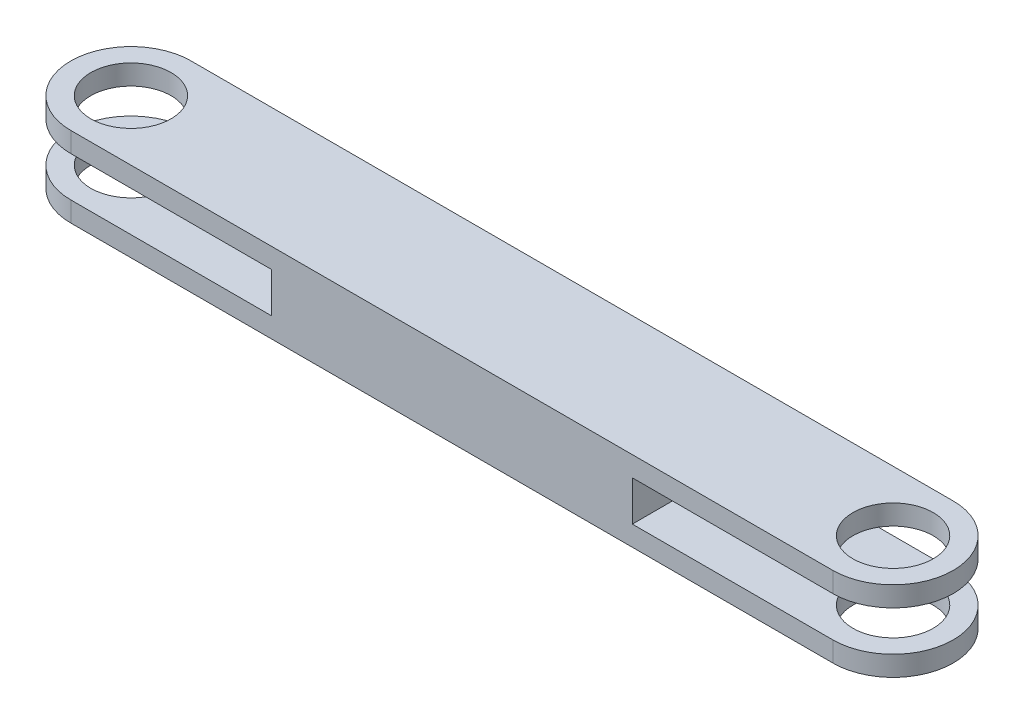
ISO-10303-21;
HEADER;
FILE_DESCRIPTION(('STEP AP214'),'2;1');
FILE_NAME('part.step','',(''),(''),'','','');
FILE_SCHEMA(('AUTOMOTIVE_DESIGN { 1 0 10303 214 1 1 1 1 }'));
ENDSEC;
DATA;
#1=APPLICATION_CONTEXT('core data for automotive mechanical design processes');
#2=APPLICATION_PROTOCOL_DEFINITION('international standard','automotive_design',2000,#1);
#3=PRODUCT_CONTEXT('',#1,'mechanical');
#4=PRODUCT('Part','Part','',(#3));
#5=PRODUCT_RELATED_PRODUCT_CATEGORY('part','',(#4));
#6=PRODUCT_DEFINITION_FORMATION('','',#4);
#7=PRODUCT_DEFINITION_CONTEXT('part definition',#1,'design');
#8=PRODUCT_DEFINITION('design','',#6,#7);
#9=PRODUCT_DEFINITION_SHAPE('','',#8);
#10=(LENGTH_UNIT() NAMED_UNIT(*) SI_UNIT(.MILLI.,.METRE.));
#11=(NAMED_UNIT(*) PLANE_ANGLE_UNIT() SI_UNIT($,.RADIAN.));
#12=(NAMED_UNIT(*) SI_UNIT($,.STERADIAN.) SOLID_ANGLE_UNIT());
#13=UNCERTAINTY_MEASURE_WITH_UNIT(LENGTH_MEASURE(1.E-05),#10,'distance_accuracy_value','');
#14=(GEOMETRIC_REPRESENTATION_CONTEXT(3) GLOBAL_UNCERTAINTY_ASSIGNED_CONTEXT((#13)) GLOBAL_UNIT_ASSIGNED_CONTEXT((#10,
#11,#12)) REPRESENTATION_CONTEXT('',''));
#15=CARTESIAN_POINT('',(0.,0.,0.));
#16=DIRECTION('',(0.,0.,1.));
#17=DIRECTION('',(1.,0.,0.));
#18=AXIS2_PLACEMENT_3D('',#15,#16,#17);
#19=CARTESIAN_POINT('',(0.,10.,15.));
#20=DIRECTION('',(0.,0.,-1.));
#21=DIRECTION('',(-1.,0.,0.));
#22=AXIS2_PLACEMENT_3D('',#19,#20,#21);
#23=PLANE('',#22);
#24=DIRECTION('',(-1.,0.,0.));
#25=VECTOR('',#24,1.);
#26=CARTESIAN_POINT('',(94.9999999999999,-5.,15.));
#27=LINE('',#26,#25);
#28=CARTESIAN_POINT('',(94.9999999999999,-5.,15.));
#29=VERTEX_POINT('',#28);
#30=CARTESIAN_POINT('',(45.,-5.,15.));
#31=VERTEX_POINT('',#30);
#32=EDGE_CURVE('E136',#29,#31,#27,.T.);
#33=ORIENTED_EDGE('',*,*,#32,.T.);
#34=DIRECTION('',(0.,1.,0.));
#35=VECTOR('',#34,1.);
#36=CARTESIAN_POINT('',(45.,-5.,15.));
#37=LINE('',#36,#35);
#38=CARTESIAN_POINT('',(45.,5.,15.));
#39=VERTEX_POINT('',#38);
#40=EDGE_CURVE('E133',#31,#39,#37,.T.);
#41=ORIENTED_EDGE('',*,*,#40,.T.);
#42=DIRECTION('',(-1.,0.,0.));
#43=VECTOR('',#42,1.);
#44=CARTESIAN_POINT('',(94.9999999999999,5.,15.));
#45=LINE('',#44,#43);
#46=CARTESIAN_POINT('',(94.9999999999999,5.,15.));
#47=VERTEX_POINT('',#46);
#48=EDGE_CURVE('E305',#47,#39,#45,.T.);
#49=ORIENTED_EDGE('',*,*,#48,.F.);
#50=DIRECTION('',(0.,-1.,0.));
#51=VECTOR('',#50,1.);
#52=CARTESIAN_POINT('',(95.,10.,15.));
#53=LINE('',#52,#51);
#54=CARTESIAN_POINT('',(95.,10.,15.));
#55=VERTEX_POINT('',#54);
#56=EDGE_CURVE('E222',#55,#47,#53,.T.);
#57=ORIENTED_EDGE('',*,*,#56,.F.);
#58=DIRECTION('',(1.,0.,0.));
#59=VECTOR('',#58,1.);
#60=CARTESIAN_POINT('',(0.,10.,15.));
#61=LINE('',#60,#59);
#62=CARTESIAN_POINT('',(-94.9999999999999,10.,15.));
#63=VERTEX_POINT('',#62);
#64=EDGE_CURVE('E186',#63,#55,#61,.T.);
#65=ORIENTED_EDGE('',*,*,#64,.F.);
#66=DIRECTION('',(0.,-1.,0.));
#67=VECTOR('',#66,1.);
#68=CARTESIAN_POINT('',(-94.9999999999999,10.,15.));
#69=LINE('',#68,#67);
#70=CARTESIAN_POINT('',(-94.9999999999999,5.,15.));
#71=VERTEX_POINT('',#70);
#72=EDGE_CURVE('E11',#63,#71,#69,.T.);
#73=ORIENTED_EDGE('',*,*,#72,.T.);
#74=DIRECTION('',(1.,0.,0.));
#75=VECTOR('',#74,1.);
#76=CARTESIAN_POINT('',(-94.9999999999999,5.,15.));
#77=LINE('',#76,#75);
#78=CARTESIAN_POINT('',(-45.,5.,15.));
#79=VERTEX_POINT('',#78);
#80=EDGE_CURVE('E169',#71,#79,#77,.T.);
#81=ORIENTED_EDGE('',*,*,#80,.T.);
#82=DIRECTION('',(0.,1.,0.));
#83=VECTOR('',#82,1.);
#84=CARTESIAN_POINT('',(-45.,-5.,15.));
#85=LINE('',#84,#83);
#86=CARTESIAN_POINT('',(-45.,-5.,15.));
#87=VERTEX_POINT('',#86);
#88=EDGE_CURVE('E165',#87,#79,#85,.T.);
#89=ORIENTED_EDGE('',*,*,#88,.F.);
#90=DIRECTION('',(1.,0.,0.));
#91=VECTOR('',#90,1.);
#92=CARTESIAN_POINT('',(-94.9999999999999,-5.,15.));
#93=LINE('',#92,#91);
#94=CARTESIAN_POINT('',(-94.9999999999999,-5.,15.));
#95=VERTEX_POINT('',#94);
#96=EDGE_CURVE('E160',#95,#87,#93,.T.);
#97=ORIENTED_EDGE('',*,*,#96,.F.);
#98=CARTESIAN_POINT('',(-94.9999999999999,-10.,15.));
#99=VERTEX_POINT('',#98);
#100=EDGE_CURVE('E44',#95,#99,#69,.T.);
#101=ORIENTED_EDGE('',*,*,#100,.T.);
#102=DIRECTION('',(1.,0.,0.));
#103=VECTOR('',#102,1.);
#104=CARTESIAN_POINT('',(0.,-10.,15.));
#105=LINE('',#104,#103);
#106=CARTESIAN_POINT('',(95.,-10.,15.));
#107=VERTEX_POINT('',#106);
#108=EDGE_CURVE('E204',#99,#107,#105,.T.);
#109=ORIENTED_EDGE('',*,*,#108,.T.);
#110=EDGE_CURVE('E221',#29,#107,#53,.T.);
#111=ORIENTED_EDGE('',*,*,#110,.F.);
#112=EDGE_LOOP('',(#33,#41,#49,#57,#65,#73,#81,#89,#97,#101,#109,#111));
#113=FACE_BOUND('',#112,.T.);
#114=ADVANCED_FACE('F35',(#113),#23,.F.);
#115=CARTESIAN_POINT('',(0.,10.,-15.));
#116=DIRECTION('',(0.,0.,-1.));
#117=DIRECTION('',(-1.,0.,0.));
#118=AXIS2_PLACEMENT_3D('',#115,#116,#117);
#119=PLANE('',#118);
#120=DIRECTION('',(0.,1.,0.));
#121=VECTOR('',#120,1.);
#122=CARTESIAN_POINT('',(44.9999999999999,-5.,-15.));
#123=LINE('',#122,#121);
#124=CARTESIAN_POINT('',(44.9999999999999,-5.,-15.));
#125=VERTEX_POINT('',#124);
#126=CARTESIAN_POINT('',(44.9999999999999,5.,-15.));
#127=VERTEX_POINT('',#126);
#128=EDGE_CURVE('E131',#125,#127,#123,.T.);
#129=ORIENTED_EDGE('',*,*,#128,.F.);
#130=DIRECTION('',(1.,0.,0.));
#131=VECTOR('',#130,1.);
#132=CARTESIAN_POINT('',(44.9999999999999,-5.,-15.));
#133=LINE('',#132,#131);
#134=CARTESIAN_POINT('',(95.,-5.,-15.));
#135=VERTEX_POINT('',#134);
#136=EDGE_CURVE('E137',#125,#135,#133,.T.);
#137=ORIENTED_EDGE('',*,*,#136,.T.);
#138=DIRECTION('',(0.,-1.,0.));
#139=VECTOR('',#138,1.);
#140=CARTESIAN_POINT('',(95.,10.,-15.));
#141=LINE('',#140,#139);
#142=CARTESIAN_POINT('',(95.,-10.,-15.));
#143=VERTEX_POINT('',#142);
#144=EDGE_CURVE('E218',#135,#143,#141,.T.);
#145=ORIENTED_EDGE('',*,*,#144,.T.);
#146=DIRECTION('',(1.,0.,0.));
#147=VECTOR('',#146,1.);
#148=CARTESIAN_POINT('',(0.,-10.,-15.));
#149=LINE('',#148,#147);
#150=CARTESIAN_POINT('',(-95.,-10.,-15.));
#151=VERTEX_POINT('',#150);
#152=EDGE_CURVE('E210',#151,#143,#149,.T.);
#153=ORIENTED_EDGE('',*,*,#152,.F.);
#154=DIRECTION('',(0.,-1.,0.));
#155=VECTOR('',#154,1.);
#156=CARTESIAN_POINT('',(-95.,10.,-15.));
#157=LINE('',#156,#155);
#158=CARTESIAN_POINT('',(-95.,-5.,-15.));
#159=VERTEX_POINT('',#158);
#160=EDGE_CURVE('E196',#159,#151,#157,.T.);
#161=ORIENTED_EDGE('',*,*,#160,.F.);
#162=DIRECTION('',(-1.,0.,0.));
#163=VECTOR('',#162,1.);
#164=CARTESIAN_POINT('',(-44.9999999999999,-5.,-15.));
#165=LINE('',#164,#163);
#166=CARTESIAN_POINT('',(-44.9999999999999,-5.,-15.));
#167=VERTEX_POINT('',#166);
#168=EDGE_CURVE('E155',#167,#159,#165,.T.);
#169=ORIENTED_EDGE('',*,*,#168,.F.);
#170=DIRECTION('',(0.,1.,0.));
#171=VECTOR('',#170,1.);
#172=CARTESIAN_POINT('',(-44.9999999999999,-5.,-15.));
#173=LINE('',#172,#171);
#174=CARTESIAN_POINT('',(-44.9999999999999,5.,-15.));
#175=VERTEX_POINT('',#174);
#176=EDGE_CURVE('E174',#167,#175,#173,.T.);
#177=ORIENTED_EDGE('',*,*,#176,.T.);
#178=DIRECTION('',(-1.,0.,0.));
#179=VECTOR('',#178,1.);
#180=CARTESIAN_POINT('',(-44.9999999999999,5.,-15.));
#181=LINE('',#180,#179);
#182=CARTESIAN_POINT('',(-95.,5.,-15.));
#183=VERTEX_POINT('',#182);
#184=EDGE_CURVE('E166',#175,#183,#181,.T.);
#185=ORIENTED_EDGE('',*,*,#184,.T.);
#186=CARTESIAN_POINT('',(-95.,10.,-15.));
#187=VERTEX_POINT('',#186);
#188=EDGE_CURVE('E215',#187,#183,#157,.T.);
#189=ORIENTED_EDGE('',*,*,#188,.F.);
#190=DIRECTION('',(1.,0.,0.));
#191=VECTOR('',#190,1.);
#192=CARTESIAN_POINT('',(0.,10.,-15.));
#193=LINE('',#192,#191);
#194=CARTESIAN_POINT('',(95.,10.,-15.));
#195=VERTEX_POINT('',#194);
#196=EDGE_CURVE('E190',#187,#195,#193,.T.);
#197=ORIENTED_EDGE('',*,*,#196,.T.);
#198=CARTESIAN_POINT('',(95.,5.,-15.));
#199=VERTEX_POINT('',#198);
#200=EDGE_CURVE('E219',#195,#199,#141,.T.);
#201=ORIENTED_EDGE('',*,*,#200,.T.);
#202=DIRECTION('',(1.,0.,0.));
#203=VECTOR('',#202,1.);
#204=CARTESIAN_POINT('',(44.9999999999999,5.,-15.));
#205=LINE('',#204,#203);
#206=EDGE_CURVE('E52',#127,#199,#205,.T.);
#207=ORIENTED_EDGE('',*,*,#206,.F.);
#208=EDGE_LOOP('',(#129,#137,#145,#153,#161,#169,#177,#185,#189,#197,#201,#207));
#209=FACE_BOUND('',#208,.T.);
#210=ADVANCED_FACE('F147',(#209),#119,.T.);
#211=CARTESIAN_POINT('',(95.,10.,0.));
#212=DIRECTION('',(0.,-1.,0.));
#213=DIRECTION('',(0.,0.,-1.));
#214=AXIS2_PLACEMENT_3D('',#211,#212,#213);
#215=CYLINDRICAL_SURFACE('',#214,15.);
#216=CARTESIAN_POINT('',(95.,-5.,0.));
#217=DIRECTION('',(0.,-1.,0.));
#218=DIRECTION('',(0.,0.,1.));
#219=AXIS2_PLACEMENT_3D('',#216,#217,#218);
#220=CIRCLE('',#219,15.);
#221=EDGE_CURVE('E142',#135,#29,#220,.T.);
#222=ORIENTED_EDGE('',*,*,#221,.T.);
#223=ORIENTED_EDGE('',*,*,#110,.T.);
#224=CARTESIAN_POINT('',(95.,-10.,0.));
#225=DIRECTION('',(0.,1.,0.));
#226=DIRECTION('',(0.,0.,1.));
#227=AXIS2_PLACEMENT_3D('',#224,#225,#226);
#228=CIRCLE('',#227,15.);
#229=EDGE_CURVE('E207',#107,#143,#228,.T.);
#230=ORIENTED_EDGE('',*,*,#229,.T.);
#231=ORIENTED_EDGE('',*,*,#144,.F.);
#232=EDGE_LOOP('',(#222,#223,#230,#231));
#233=FACE_BOUND('',#232,.T.);
#234=ADVANCED_FACE('F252',(#233),#215,.T.);
#235=CARTESIAN_POINT('',(95.,10.,0.));
#236=DIRECTION('',(0.,-1.,0.));
#237=DIRECTION('',(0.,0.,-1.));
#238=AXIS2_PLACEMENT_3D('',#235,#236,#237);
#239=CYLINDRICAL_SURFACE('',#238,10.);
#240=CARTESIAN_POINT('',(95.,-10.,0.));
#241=DIRECTION('',(0.,1.,0.));
#242=DIRECTION('',(0.,0.,1.));
#243=AXIS2_PLACEMENT_3D('',#240,#241,#242);
#244=CIRCLE('',#243,10.);
#245=CARTESIAN_POINT('',(95.,-10.,10.));
#246=VERTEX_POINT('',#245);
#247=EDGE_CURVE('E197',#246,#246,#244,.T.);
#248=ORIENTED_EDGE('',*,*,#247,.F.);
#249=EDGE_LOOP('',(#248));
#250=FACE_BOUND('',#249,.T.);
#251=CARTESIAN_POINT('',(95.,-5.,0.));
#252=DIRECTION('',(0.,1.,0.));
#253=DIRECTION('',(0.,0.,1.));
#254=AXIS2_PLACEMENT_3D('',#251,#252,#253);
#255=CIRCLE('',#254,10.);
#256=CARTESIAN_POINT('',(95.,-5.,10.));
#257=VERTEX_POINT('',#256);
#258=EDGE_CURVE('E39',#257,#257,#255,.T.);
#259=ORIENTED_EDGE('',*,*,#258,.T.);
#260=EDGE_LOOP('',(#259));
#261=FACE_BOUND('',#260,.T.);
#262=ADVANCED_FACE('F234',(#250,#261),#239,.F.);
#263=CARTESIAN_POINT('',(-95.,10.,0.));
#264=DIRECTION('',(0.,-1.,0.));
#265=DIRECTION('',(0.,0.,-1.));
#266=AXIS2_PLACEMENT_3D('',#263,#264,#265);
#267=CYLINDRICAL_SURFACE('',#266,15.);
#268=CARTESIAN_POINT('',(-95.,-5.,0.));
#269=DIRECTION('',(0.,1.,0.));
#270=DIRECTION('',(0.,0.,1.));
#271=AXIS2_PLACEMENT_3D('',#268,#269,#270);
#272=CIRCLE('',#271,15.);
#273=EDGE_CURVE('E157',#159,#95,#272,.T.);
#274=ORIENTED_EDGE('',*,*,#273,.F.);
#275=ORIENTED_EDGE('',*,*,#160,.T.);
#276=CARTESIAN_POINT('',(-95.,-10.,0.));
#277=DIRECTION('',(0.,1.,0.));
#278=DIRECTION('',(0.,0.,1.));
#279=AXIS2_PLACEMENT_3D('',#276,#277,#278);
#280=CIRCLE('',#279,15.);
#281=EDGE_CURVE('E200',#151,#99,#280,.T.);
#282=ORIENTED_EDGE('',*,*,#281,.T.);
#283=ORIENTED_EDGE('',*,*,#100,.F.);
#284=EDGE_LOOP('',(#274,#275,#282,#283));
#285=FACE_BOUND('',#284,.T.);
#286=ADVANCED_FACE('F260',(#285),#267,.T.);
#287=CARTESIAN_POINT('',(-95.,10.,0.));
#288=DIRECTION('',(0.,-1.,0.));
#289=DIRECTION('',(0.,0.,-1.));
#290=AXIS2_PLACEMENT_3D('',#287,#288,#289);
#291=CYLINDRICAL_SURFACE('',#290,10.);
#292=CARTESIAN_POINT('',(-95.,-10.,0.));
#293=DIRECTION('',(0.,1.,0.));
#294=DIRECTION('',(0.,0.,1.));
#295=AXIS2_PLACEMENT_3D('',#292,#293,#294);
#296=CIRCLE('',#295,10.);
#297=CARTESIAN_POINT('',(-95.,-10.,10.));
#298=VERTEX_POINT('',#297);
#299=EDGE_CURVE('E183',#298,#298,#296,.T.);
#300=ORIENTED_EDGE('',*,*,#299,.F.);
#301=EDGE_LOOP('',(#300));
#302=FACE_BOUND('',#301,.T.);
#303=CARTESIAN_POINT('',(-95.,-5.,0.));
#304=DIRECTION('',(0.,1.,0.));
#305=DIRECTION('',(0.,0.,1.));
#306=AXIS2_PLACEMENT_3D('',#303,#304,#305);
#307=CIRCLE('',#306,10.);
#308=CARTESIAN_POINT('',(-95.,-5.,10.));
#309=VERTEX_POINT('',#308);
#310=EDGE_CURVE('E201',#309,#309,#307,.T.);
#311=ORIENTED_EDGE('',*,*,#310,.T.);
#312=EDGE_LOOP('',(#311));
#313=FACE_BOUND('',#312,.T.);
#314=ADVANCED_FACE('F258',(#302,#313),#291,.F.);
#315=ORIENTED_EDGE('',*,*,#188,.T.);
#316=CARTESIAN_POINT('',(-95.,5.,0.));
#317=DIRECTION('',(0.,1.,0.));
#318=DIRECTION('',(0.,0.,1.));
#319=AXIS2_PLACEMENT_3D('',#316,#317,#318);
#320=CIRCLE('',#319,15.);
#321=EDGE_CURVE('E60',#183,#71,#320,.T.);
#322=ORIENTED_EDGE('',*,*,#321,.T.);
#323=ORIENTED_EDGE('',*,*,#72,.F.);
#324=CARTESIAN_POINT('',(-95.,10.,0.));
#325=DIRECTION('',(0.,1.,0.));
#326=DIRECTION('',(0.,0.,1.));
#327=AXIS2_PLACEMENT_3D('',#324,#325,#326);
#328=CIRCLE('',#327,15.);
#329=EDGE_CURVE('E182',#187,#63,#328,.T.);
#330=ORIENTED_EDGE('',*,*,#329,.F.);
#331=EDGE_LOOP('',(#315,#322,#323,#330));
#332=FACE_BOUND('',#331,.T.);
#333=ADVANCED_FACE('F256',(#332),#267,.T.);
#334=ORIENTED_EDGE('',*,*,#56,.T.);
#335=CARTESIAN_POINT('',(95.,5.,0.));
#336=DIRECTION('',(0.,-1.,0.));
#337=DIRECTION('',(0.,0.,1.));
#338=AXIS2_PLACEMENT_3D('',#335,#336,#337);
#339=CIRCLE('',#338,15.);
#340=EDGE_CURVE('E145',#199,#47,#339,.T.);
#341=ORIENTED_EDGE('',*,*,#340,.F.);
#342=ORIENTED_EDGE('',*,*,#200,.F.);
#343=CARTESIAN_POINT('',(95.,10.,0.));
#344=DIRECTION('',(0.,1.,0.));
#345=DIRECTION('',(0.,0.,1.));
#346=AXIS2_PLACEMENT_3D('',#343,#344,#345);
#347=CIRCLE('',#346,15.);
#348=EDGE_CURVE('E188',#55,#195,#347,.T.);
#349=ORIENTED_EDGE('',*,*,#348,.F.);
#350=EDGE_LOOP('',(#334,#341,#342,#349));
#351=FACE_BOUND('',#350,.T.);
#352=ADVANCED_FACE('F255',(#351),#215,.T.);
#353=CARTESIAN_POINT('',(95.,5.,0.));
#354=DIRECTION('',(0.,1.,0.));
#355=DIRECTION('',(0.,0.,1.));
#356=AXIS2_PLACEMENT_3D('',#353,#354,#355);
#357=CIRCLE('',#356,10.);
#358=CARTESIAN_POINT('',(95.,5.,10.));
#359=VERTEX_POINT('',#358);
#360=EDGE_CURVE('E150',#359,#359,#357,.T.);
#361=ORIENTED_EDGE('',*,*,#360,.F.);
#362=EDGE_LOOP('',(#361));
#363=FACE_BOUND('',#362,.T.);
#364=CARTESIAN_POINT('',(95.,10.,0.));
#365=DIRECTION('',(0.,1.,0.));
#366=DIRECTION('',(0.,0.,1.));
#367=AXIS2_PLACEMENT_3D('',#364,#365,#366);
#368=CIRCLE('',#367,10.);
#369=CARTESIAN_POINT('',(95.,10.,10.));
#370=VERTEX_POINT('',#369);
#371=EDGE_CURVE('E179',#370,#370,#368,.T.);
#372=ORIENTED_EDGE('',*,*,#371,.T.);
#373=EDGE_LOOP('',(#372));
#374=FACE_BOUND('',#373,.T.);
#375=ADVANCED_FACE('F37',(#363,#374),#239,.F.);
#376=CARTESIAN_POINT('',(-95.,5.,0.));
#377=DIRECTION('',(0.,1.,0.));
#378=DIRECTION('',(0.,0.,1.));
#379=AXIS2_PLACEMENT_3D('',#376,#377,#378);
#380=CIRCLE('',#379,10.);
#381=CARTESIAN_POINT('',(-95.,5.,10.));
#382=VERTEX_POINT('',#381);
#383=EDGE_CURVE('E177',#382,#382,#380,.T.);
#384=ORIENTED_EDGE('',*,*,#383,.F.);
#385=EDGE_LOOP('',(#384));
#386=FACE_BOUND('',#385,.T.);
#387=CARTESIAN_POINT('',(-95.,10.,0.));
#388=DIRECTION('',(0.,1.,0.));
#389=DIRECTION('',(0.,0.,1.));
#390=AXIS2_PLACEMENT_3D('',#387,#388,#389);
#391=CIRCLE('',#390,10.);
#392=CARTESIAN_POINT('',(-95.,10.,10.));
#393=VERTEX_POINT('',#392);
#394=EDGE_CURVE('E193',#393,#393,#391,.T.);
#395=ORIENTED_EDGE('',*,*,#394,.T.);
#396=EDGE_LOOP('',(#395));
#397=FACE_BOUND('',#396,.T.);
#398=ADVANCED_FACE('F268',(#386,#397),#291,.F.);
#399=CARTESIAN_POINT('',(0.,10.,0.));
#400=DIRECTION('',(0.,1.,0.));
#401=DIRECTION('',(0.,0.,1.));
#402=AXIS2_PLACEMENT_3D('',#399,#400,#401);
#403=PLANE('',#402);
#404=ORIENTED_EDGE('',*,*,#371,.F.);
#405=EDGE_LOOP('',(#404));
#406=FACE_BOUND('',#405,.T.);
#407=ORIENTED_EDGE('',*,*,#329,.T.);
#408=ORIENTED_EDGE('',*,*,#64,.T.);
#409=ORIENTED_EDGE('',*,*,#348,.T.);
#410=ORIENTED_EDGE('',*,*,#196,.F.);
#411=EDGE_LOOP('',(#407,#408,#409,#410));
#412=FACE_BOUND('',#411,.T.);
#413=ORIENTED_EDGE('',*,*,#394,.F.);
#414=EDGE_LOOP('',(#413));
#415=FACE_BOUND('',#414,.T.);
#416=ADVANCED_FACE('F299',(#406,#412,#415),#403,.T.);
#417=CARTESIAN_POINT('',(0.,-10.,0.));
#418=DIRECTION('',(0.,1.,0.));
#419=DIRECTION('',(0.,0.,1.));
#420=AXIS2_PLACEMENT_3D('',#417,#418,#419);
#421=PLANE('',#420);
#422=ORIENTED_EDGE('',*,*,#247,.T.);
#423=EDGE_LOOP('',(#422));
#424=FACE_BOUND('',#423,.T.);
#425=ORIENTED_EDGE('',*,*,#281,.F.);
#426=ORIENTED_EDGE('',*,*,#152,.T.);
#427=ORIENTED_EDGE('',*,*,#229,.F.);
#428=ORIENTED_EDGE('',*,*,#108,.F.);
#429=EDGE_LOOP('',(#425,#426,#427,#428));
#430=FACE_BOUND('',#429,.T.);
#431=ORIENTED_EDGE('',*,*,#299,.T.);
#432=EDGE_LOOP('',(#431));
#433=FACE_BOUND('',#432,.T.);
#434=ADVANCED_FACE('F285',(#424,#430,#433),#421,.F.);
#435=CARTESIAN_POINT('',(-44.9999999999999,-5.,-15.));
#436=DIRECTION('',(1.,0.,0.));
#437=DIRECTION('',(0.,0.,-1.));
#438=AXIS2_PLACEMENT_3D('',#435,#436,#437);
#439=PLANE('',#438);
#440=DIRECTION('',(0.,0.,-1.));
#441=VECTOR('',#440,1.);
#442=CARTESIAN_POINT('',(-44.9999999999999,5.,-15.));
#443=LINE('',#442,#441);
#444=EDGE_CURVE('E158',#79,#175,#443,.T.);
#445=ORIENTED_EDGE('',*,*,#444,.T.);
#446=ORIENTED_EDGE('',*,*,#176,.F.);
#447=DIRECTION('',(0.,0.,-1.));
#448=VECTOR('',#447,1.);
#449=CARTESIAN_POINT('',(-44.9999999999999,-5.,-15.));
#450=LINE('',#449,#448);
#451=EDGE_CURVE('E162',#87,#167,#450,.T.);
#452=ORIENTED_EDGE('',*,*,#451,.F.);
#453=ORIENTED_EDGE('',*,*,#88,.T.);
#454=EDGE_LOOP('',(#445,#446,#452,#453));
#455=FACE_BOUND('',#454,.T.);
#456=ADVANCED_FACE('F293',(#455),#439,.F.);
#457=CARTESIAN_POINT('',(-95.,-5.,0.));
#458=DIRECTION('',(0.,1.,0.));
#459=DIRECTION('',(0.,0.,1.));
#460=AXIS2_PLACEMENT_3D('',#457,#458,#459);
#461=PLANE('',#460);
#462=ORIENTED_EDGE('',*,*,#310,.F.);
#463=EDGE_LOOP('',(#462));
#464=FACE_BOUND('',#463,.T.);
#465=ORIENTED_EDGE('',*,*,#168,.T.);
#466=ORIENTED_EDGE('',*,*,#273,.T.);
#467=ORIENTED_EDGE('',*,*,#96,.T.);
#468=ORIENTED_EDGE('',*,*,#451,.T.);
#469=EDGE_LOOP('',(#465,#466,#467,#468));
#470=FACE_BOUND('',#469,.T.);
#471=ADVANCED_FACE('F291',(#464,#470),#461,.T.);
#472=CARTESIAN_POINT('',(-95.,5.,0.));
#473=DIRECTION('',(0.,1.,0.));
#474=DIRECTION('',(0.,0.,1.));
#475=AXIS2_PLACEMENT_3D('',#472,#473,#474);
#476=PLANE('',#475);
#477=ORIENTED_EDGE('',*,*,#383,.T.);
#478=EDGE_LOOP('',(#477));
#479=FACE_BOUND('',#478,.T.);
#480=ORIENTED_EDGE('',*,*,#184,.F.);
#481=ORIENTED_EDGE('',*,*,#444,.F.);
#482=ORIENTED_EDGE('',*,*,#80,.F.);
#483=ORIENTED_EDGE('',*,*,#321,.F.);
#484=EDGE_LOOP('',(#480,#481,#482,#483));
#485=FACE_BOUND('',#484,.T.);
#486=ADVANCED_FACE('F244',(#479,#485),#476,.F.);
#487=CARTESIAN_POINT('',(44.9999999999999,-5.,-15.));
#488=DIRECTION('',(1.,0.,0.));
#489=DIRECTION('',(0.,0.,-1.));
#490=AXIS2_PLACEMENT_3D('',#487,#488,#489);
#491=PLANE('',#490);
#492=DIRECTION('',(0.,0.,-1.));
#493=VECTOR('',#492,1.);
#494=CARTESIAN_POINT('',(44.9999999999999,5.,-15.));
#495=LINE('',#494,#493);
#496=EDGE_CURVE('E306',#39,#127,#495,.T.);
#497=ORIENTED_EDGE('',*,*,#496,.F.);
#498=ORIENTED_EDGE('',*,*,#40,.F.);
#499=DIRECTION('',(0.,0.,-1.));
#500=VECTOR('',#499,1.);
#501=CARTESIAN_POINT('',(44.9999999999999,-5.,-15.));
#502=LINE('',#501,#500);
#503=EDGE_CURVE('E126',#31,#125,#502,.T.);
#504=ORIENTED_EDGE('',*,*,#503,.T.);
#505=ORIENTED_EDGE('',*,*,#128,.T.);
#506=EDGE_LOOP('',(#497,#498,#504,#505));
#507=FACE_BOUND('',#506,.T.);
#508=ADVANCED_FACE('F129',(#507),#491,.T.);
#509=CARTESIAN_POINT('',(95.,-5.,0.));
#510=DIRECTION('',(0.,1.,0.));
#511=DIRECTION('',(0.,0.,1.));
#512=AXIS2_PLACEMENT_3D('',#509,#510,#511);
#513=PLANE('',#512);
#514=ORIENTED_EDGE('',*,*,#258,.F.);
#515=EDGE_LOOP('',(#514));
#516=FACE_BOUND('',#515,.T.);
#517=ORIENTED_EDGE('',*,*,#136,.F.);
#518=ORIENTED_EDGE('',*,*,#503,.F.);
#519=ORIENTED_EDGE('',*,*,#32,.F.);
#520=ORIENTED_EDGE('',*,*,#221,.F.);
#521=EDGE_LOOP('',(#517,#518,#519,#520));
#522=FACE_BOUND('',#521,.T.);
#523=ADVANCED_FACE('F140',(#516,#522),#513,.T.);
#524=CARTESIAN_POINT('',(95.,5.,0.));
#525=DIRECTION('',(0.,1.,0.));
#526=DIRECTION('',(0.,0.,1.));
#527=AXIS2_PLACEMENT_3D('',#524,#525,#526);
#528=PLANE('',#527);
#529=ORIENTED_EDGE('',*,*,#360,.T.);
#530=EDGE_LOOP('',(#529));
#531=FACE_BOUND('',#530,.T.);
#532=ORIENTED_EDGE('',*,*,#206,.T.);
#533=ORIENTED_EDGE('',*,*,#340,.T.);
#534=ORIENTED_EDGE('',*,*,#48,.T.);
#535=ORIENTED_EDGE('',*,*,#496,.T.);
#536=EDGE_LOOP('',(#532,#533,#534,#535));
#537=FACE_BOUND('',#536,.T.);
#538=ADVANCED_FACE('F237',(#531,#537),#528,.F.);
#539=CLOSED_SHELL('',(#114,#210,#234,#262,#286,#314,#333,#352,#375,#398,#416,#434,#456,#471,
#486,#508,#523,#538));
#540=MANIFOLD_SOLID_BREP('B2',#539);
#541=ADVANCED_BREP_SHAPE_REPRESENTATION('',(#18,#540),#14);
#542=SHAPE_DEFINITION_REPRESENTATION(#9,#541);
ENDSEC;
END-ISO-10303-21;
